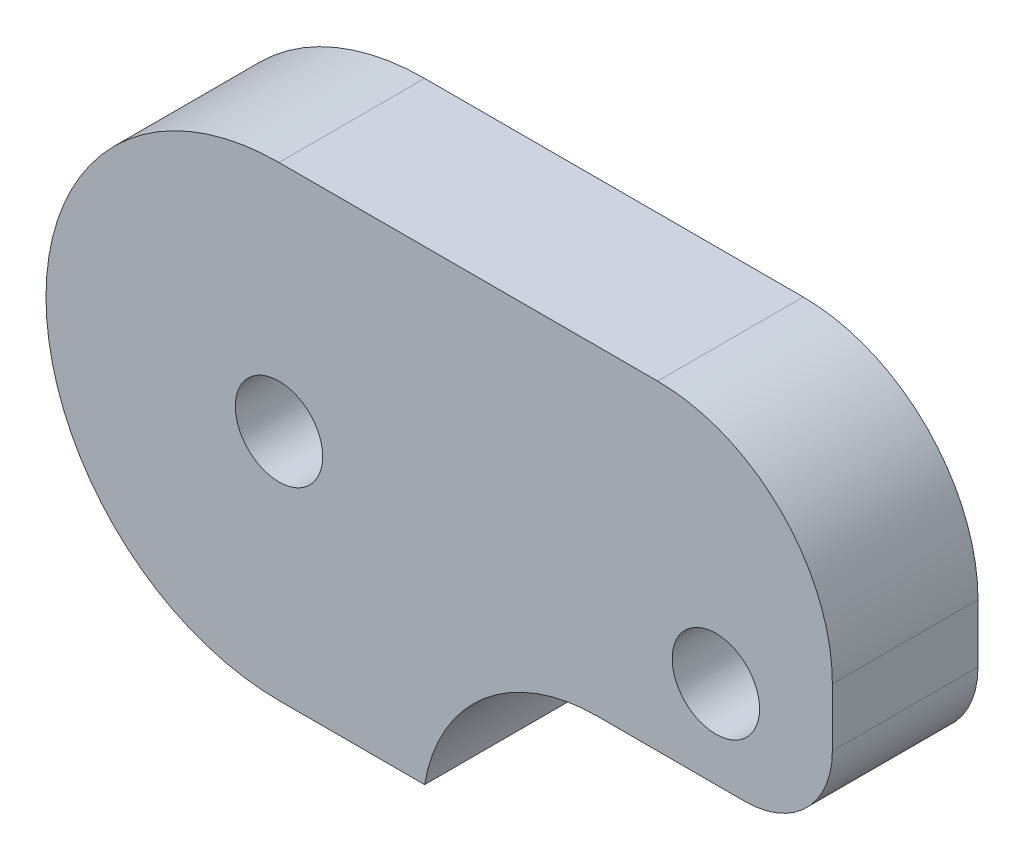
ISO-10303-21;
HEADER;
FILE_DESCRIPTION(('STEP AP214'),'2;1');
FILE_NAME('part.step','',(''),(''),'','','');
FILE_SCHEMA(('AUTOMOTIVE_DESIGN { 1 0 10303 214 1 1 1 1 }'));
ENDSEC;
DATA;
#1=APPLICATION_CONTEXT('core data for automotive mechanical design processes');
#2=APPLICATION_PROTOCOL_DEFINITION('international standard','automotive_design',2000,#1);
#3=PRODUCT_CONTEXT('',#1,'mechanical');
#4=PRODUCT('Part','Part','',(#3));
#5=PRODUCT_RELATED_PRODUCT_CATEGORY('part','',(#4));
#6=PRODUCT_DEFINITION_FORMATION('','',#4);
#7=PRODUCT_DEFINITION_CONTEXT('part definition',#1,'design');
#8=PRODUCT_DEFINITION('design','',#6,#7);
#9=PRODUCT_DEFINITION_SHAPE('','',#8);
#10=(LENGTH_UNIT() NAMED_UNIT(*) SI_UNIT(.MILLI.,.METRE.));
#11=(NAMED_UNIT(*) PLANE_ANGLE_UNIT() SI_UNIT($,.RADIAN.));
#12=(NAMED_UNIT(*) SI_UNIT($,.STERADIAN.) SOLID_ANGLE_UNIT());
#13=UNCERTAINTY_MEASURE_WITH_UNIT(LENGTH_MEASURE(1.E-05),#10,'distance_accuracy_value','');
#14=(GEOMETRIC_REPRESENTATION_CONTEXT(3) GLOBAL_UNCERTAINTY_ASSIGNED_CONTEXT((#13)) GLOBAL_UNIT_ASSIGNED_CONTEXT((#10,
#11,#12)) REPRESENTATION_CONTEXT('',''));
#15=CARTESIAN_POINT('',(0.,0.,0.));
#16=DIRECTION('',(0.,0.,1.));
#17=DIRECTION('',(1.,0.,0.));
#18=AXIS2_PLACEMENT_3D('',#15,#16,#17);
#19=CARTESIAN_POINT('',(15.,0.,5.));
#20=DIRECTION('',(0.,0.,1.));
#21=DIRECTION('',(1.,0.,0.));
#22=AXIS2_PLACEMENT_3D('',#19,#20,#21);
#23=PLANE('',#22);
#24=CARTESIAN_POINT('',(15.,0.,5.));
#25=DIRECTION('',(0.,0.,1.));
#26=DIRECTION('',(1.,0.,0.));
#27=AXIS2_PLACEMENT_3D('',#24,#25,#26);
#28=CIRCLE('',#27,1.5);
#29=CARTESIAN_POINT('',(16.5,0.,5.));
#30=VERTEX_POINT('',#29);
#31=EDGE_CURVE('E173',#30,#30,#28,.T.);
#32=ORIENTED_EDGE('',*,*,#31,.F.);
#33=EDGE_LOOP('',(#32));
#34=FACE_BOUND('',#33,.T.);
#35=DIRECTION('',(1.,0.,0.));
#36=VECTOR('',#35,1.);
#37=CARTESIAN_POINT('',(20.,-3.,5.));
#38=LINE('',#37,#36);
#39=CARTESIAN_POINT('',(25.9160797830996,-3.,5.));
#40=VERTEX_POINT('',#39);
#41=CARTESIAN_POINT('',(31.,-3.,5.));
#42=VERTEX_POINT('',#41);
#43=EDGE_CURVE('E166',#40,#42,#38,.T.);
#44=ORIENTED_EDGE('',*,*,#43,.T.);
#45=CARTESIAN_POINT('',(31.,0.,5.));
#46=DIRECTION('',(0.,0.,1.));
#47=DIRECTION('',(1.,0.,0.));
#48=AXIS2_PLACEMENT_3D('',#45,#46,#47);
#49=CIRCLE('',#48,3.);
#50=CARTESIAN_POINT('',(34.,0.,5.));
#51=VERTEX_POINT('',#50);
#52=EDGE_CURVE('E11',#42,#51,#49,.T.);
#53=ORIENTED_EDGE('',*,*,#52,.T.);
#54=DIRECTION('',(0.,1.,0.));
#55=VECTOR('',#54,1.);
#56=CARTESIAN_POINT('',(34.,-3.,5.));
#57=LINE('',#56,#55);
#58=CARTESIAN_POINT('',(34.,2.,5.));
#59=VERTEX_POINT('',#58);
#60=EDGE_CURVE('E151',#51,#59,#57,.T.);
#61=ORIENTED_EDGE('',*,*,#60,.T.);
#62=CARTESIAN_POINT('',(28.,2.,5.));
#63=DIRECTION('',(0.,0.,1.));
#64=DIRECTION('',(1.,0.,0.));
#65=AXIS2_PLACEMENT_3D('',#62,#63,#64);
#66=CIRCLE('',#65,6.);
#67=CARTESIAN_POINT('',(28.,8.,5.));
#68=VERTEX_POINT('',#67);
#69=EDGE_CURVE('E103',#59,#68,#66,.T.);
#70=ORIENTED_EDGE('',*,*,#69,.T.);
#71=DIRECTION('',(-1.,0.,0.));
#72=VECTOR('',#71,1.);
#73=CARTESIAN_POINT('',(15.,8.,5.));
#74=LINE('',#73,#72);
#75=CARTESIAN_POINT('',(15.,8.,5.));
#76=VERTEX_POINT('',#75);
#77=EDGE_CURVE('E97',#68,#76,#74,.T.);
#78=ORIENTED_EDGE('',*,*,#77,.T.);
#79=CARTESIAN_POINT('',(15.,0.,5.));
#80=DIRECTION('',(0.,0.,1.));
#81=DIRECTION('',(1.,0.,0.));
#82=AXIS2_PLACEMENT_3D('',#79,#80,#81);
#83=CIRCLE('',#82,8.);
#84=CARTESIAN_POINT('',(15.,-8.,5.));
#85=VERTEX_POINT('',#84);
#86=EDGE_CURVE('E100',#76,#85,#83,.T.);
#87=ORIENTED_EDGE('',*,*,#86,.T.);
#88=DIRECTION('',(1.,0.,0.));
#89=VECTOR('',#88,1.);
#90=CARTESIAN_POINT('',(15.,-8.,5.));
#91=LINE('',#90,#89);
#92=CARTESIAN_POINT('',(20.,-8.,5.));
#93=VERTEX_POINT('',#92);
#94=EDGE_CURVE('E117',#85,#93,#91,.T.);
#95=ORIENTED_EDGE('',*,*,#94,.T.);
#96=CARTESIAN_POINT('',(25.9160797830996,-9.,5.));
#97=DIRECTION('',(0.,0.,1.));
#98=DIRECTION('',(1.,0.,0.));
#99=AXIS2_PLACEMENT_3D('',#96,#97,#98);
#100=CIRCLE('',#99,6.);
#101=EDGE_CURVE('E142',#93,#40,#100,.F.);
#102=ORIENTED_EDGE('',*,*,#101,.T.);
#103=EDGE_LOOP('',(#44,#53,#61,#70,#78,#87,#95,#102));
#104=FACE_BOUND('',#103,.T.);
#105=CARTESIAN_POINT('',(30.,0.,5.));
#106=DIRECTION('',(0.,0.,1.));
#107=DIRECTION('',(1.,0.,0.));
#108=AXIS2_PLACEMENT_3D('',#105,#106,#107);
#109=CIRCLE('',#108,1.5);
#110=CARTESIAN_POINT('',(31.5,0.,5.));
#111=VERTEX_POINT('',#110);
#112=EDGE_CURVE('E223',#111,#111,#109,.T.);
#113=ORIENTED_EDGE('',*,*,#112,.F.);
#114=EDGE_LOOP('',(#113));
#115=FACE_BOUND('',#114,.T.);
#116=ADVANCED_FACE('F33',(#34,#104,#115),#23,.T.);
#117=CARTESIAN_POINT('',(15.,0.,0.));
#118=DIRECTION('',(0.,0.,1.));
#119=DIRECTION('',(1.,0.,0.));
#120=AXIS2_PLACEMENT_3D('',#117,#118,#119);
#121=PLANE('',#120);
#122=CARTESIAN_POINT('',(15.,0.,0.));
#123=DIRECTION('',(0.,0.,1.));
#124=DIRECTION('',(1.,0.,0.));
#125=AXIS2_PLACEMENT_3D('',#122,#123,#124);
#126=CIRCLE('',#125,1.5);
#127=CARTESIAN_POINT('',(16.5,0.,0.));
#128=VERTEX_POINT('',#127);
#129=EDGE_CURVE('E228',#128,#128,#126,.T.);
#130=ORIENTED_EDGE('',*,*,#129,.T.);
#131=EDGE_LOOP('',(#130));
#132=FACE_BOUND('',#131,.T.);
#133=DIRECTION('',(0.,1.,0.));
#134=VECTOR('',#133,1.);
#135=CARTESIAN_POINT('',(34.,-3.,0.));
#136=LINE('',#135,#134);
#137=CARTESIAN_POINT('',(34.,0.,0.));
#138=VERTEX_POINT('',#137);
#139=CARTESIAN_POINT('',(34.,2.,0.));
#140=VERTEX_POINT('',#139);
#141=EDGE_CURVE('E108',#138,#140,#136,.T.);
#142=ORIENTED_EDGE('',*,*,#141,.F.);
#143=CARTESIAN_POINT('',(31.,0.,0.));
#144=DIRECTION('',(0.,0.,1.));
#145=DIRECTION('',(1.,0.,0.));
#146=AXIS2_PLACEMENT_3D('',#143,#144,#145);
#147=CIRCLE('',#146,3.);
#148=CARTESIAN_POINT('',(31.,-3.,0.));
#149=VERTEX_POINT('',#148);
#150=EDGE_CURVE('E55',#138,#149,#147,.F.);
#151=ORIENTED_EDGE('',*,*,#150,.T.);
#152=DIRECTION('',(1.,0.,0.));
#153=VECTOR('',#152,1.);
#154=CARTESIAN_POINT('',(20.,-3.,0.));
#155=LINE('',#154,#153);
#156=CARTESIAN_POINT('',(25.9160797830996,-3.,0.));
#157=VERTEX_POINT('',#156);
#158=EDGE_CURVE('E157',#157,#149,#155,.T.);
#159=ORIENTED_EDGE('',*,*,#158,.F.);
#160=CARTESIAN_POINT('',(25.9160797830996,-9.,0.));
#161=DIRECTION('',(0.,0.,1.));
#162=DIRECTION('',(1.,0.,0.));
#163=AXIS2_PLACEMENT_3D('',#160,#161,#162);
#164=CIRCLE('',#163,6.);
#165=CARTESIAN_POINT('',(20.,-8.,0.));
#166=VERTEX_POINT('',#165);
#167=EDGE_CURVE('E140',#157,#166,#164,.T.);
#168=ORIENTED_EDGE('',*,*,#167,.T.);
#169=DIRECTION('',(1.,0.,0.));
#170=VECTOR('',#169,1.);
#171=CARTESIAN_POINT('',(15.,-8.,0.));
#172=LINE('',#171,#170);
#173=CARTESIAN_POINT('',(15.,-8.,0.));
#174=VERTEX_POINT('',#173);
#175=EDGE_CURVE('E159',#174,#166,#172,.T.);
#176=ORIENTED_EDGE('',*,*,#175,.F.);
#177=CARTESIAN_POINT('',(15.,0.,0.));
#178=DIRECTION('',(0.,0.,1.));
#179=DIRECTION('',(1.,0.,0.));
#180=AXIS2_PLACEMENT_3D('',#177,#178,#179);
#181=CIRCLE('',#180,8.);
#182=CARTESIAN_POINT('',(15.,8.,0.));
#183=VERTEX_POINT('',#182);
#184=EDGE_CURVE('E172',#183,#174,#181,.T.);
#185=ORIENTED_EDGE('',*,*,#184,.F.);
#186=DIRECTION('',(-1.,0.,0.));
#187=VECTOR('',#186,1.);
#188=CARTESIAN_POINT('',(15.,8.,0.));
#189=LINE('',#188,#187);
#190=CARTESIAN_POINT('',(28.,8.,0.));
#191=VERTEX_POINT('',#190);
#192=EDGE_CURVE('E121',#191,#183,#189,.T.);
#193=ORIENTED_EDGE('',*,*,#192,.F.);
#194=CARTESIAN_POINT('',(28.,2.,0.));
#195=DIRECTION('',(0.,0.,1.));
#196=DIRECTION('',(1.,0.,0.));
#197=AXIS2_PLACEMENT_3D('',#194,#195,#196);
#198=CIRCLE('',#197,6.);
#199=EDGE_CURVE('E125',#191,#140,#198,.F.);
#200=ORIENTED_EDGE('',*,*,#199,.T.);
#201=EDGE_LOOP('',(#142,#151,#159,#168,#176,#185,#193,#200));
#202=FACE_BOUND('',#201,.T.);
#203=CARTESIAN_POINT('',(30.,0.,0.));
#204=DIRECTION('',(0.,0.,1.));
#205=DIRECTION('',(1.,0.,0.));
#206=AXIS2_PLACEMENT_3D('',#203,#204,#205);
#207=CIRCLE('',#206,1.5);
#208=CARTESIAN_POINT('',(31.5,0.,0.));
#209=VERTEX_POINT('',#208);
#210=EDGE_CURVE('E226',#209,#209,#207,.T.);
#211=ORIENTED_EDGE('',*,*,#210,.T.);
#212=EDGE_LOOP('',(#211));
#213=FACE_BOUND('',#212,.T.);
#214=ADVANCED_FACE('F154',(#132,#202,#213),#121,.F.);
#215=CARTESIAN_POINT('',(15.,8.,5.));
#216=DIRECTION('',(0.,-1.,0.));
#217=DIRECTION('',(0.,0.,-1.));
#218=AXIS2_PLACEMENT_3D('',#215,#216,#217);
#219=PLANE('',#218);
#220=ORIENTED_EDGE('',*,*,#77,.F.);
#221=DIRECTION('',(0.,0.,-1.));
#222=VECTOR('',#221,1.);
#223=CARTESIAN_POINT('',(28.,8.,5.));
#224=LINE('',#223,#222);
#225=EDGE_CURVE('E123',#68,#191,#224,.T.);
#226=ORIENTED_EDGE('',*,*,#225,.T.);
#227=ORIENTED_EDGE('',*,*,#192,.T.);
#228=DIRECTION('',(0.,0.,-1.));
#229=VECTOR('',#228,1.);
#230=CARTESIAN_POINT('',(15.,8.,5.));
#231=LINE('',#230,#229);
#232=EDGE_CURVE('E113',#76,#183,#231,.T.);
#233=ORIENTED_EDGE('',*,*,#232,.F.);
#234=EDGE_LOOP('',(#220,#226,#227,#233));
#235=FACE_BOUND('',#234,.T.);
#236=ADVANCED_FACE('F119',(#235),#219,.F.);
#237=CARTESIAN_POINT('',(15.,0.,5.));
#238=DIRECTION('',(0.,0.,-1.));
#239=DIRECTION('',(-1.,0.,0.));
#240=AXIS2_PLACEMENT_3D('',#237,#238,#239);
#241=CYLINDRICAL_SURFACE('',#240,8.);
#242=ORIENTED_EDGE('',*,*,#184,.T.);
#243=DIRECTION('',(0.,0.,-1.));
#244=VECTOR('',#243,1.);
#245=CARTESIAN_POINT('',(15.,-8.,5.));
#246=LINE('',#245,#244);
#247=EDGE_CURVE('E115',#85,#174,#246,.T.);
#248=ORIENTED_EDGE('',*,*,#247,.F.);
#249=ORIENTED_EDGE('',*,*,#86,.F.);
#250=ORIENTED_EDGE('',*,*,#232,.T.);
#251=EDGE_LOOP('',(#242,#248,#249,#250));
#252=FACE_BOUND('',#251,.T.);
#253=ADVANCED_FACE('F112',(#252),#241,.T.);
#254=CARTESIAN_POINT('',(15.,-8.,5.));
#255=DIRECTION('',(0.,1.,0.));
#256=DIRECTION('',(0.,0.,1.));
#257=AXIS2_PLACEMENT_3D('',#254,#255,#256);
#258=PLANE('',#257);
#259=ORIENTED_EDGE('',*,*,#175,.T.);
#260=DIRECTION('',(0.,0.,-1.));
#261=VECTOR('',#260,1.);
#262=CARTESIAN_POINT('',(20.,-8.,5.));
#263=LINE('',#262,#261);
#264=EDGE_CURVE('E127',#93,#166,#263,.T.);
#265=ORIENTED_EDGE('',*,*,#264,.F.);
#266=ORIENTED_EDGE('',*,*,#94,.F.);
#267=ORIENTED_EDGE('',*,*,#247,.T.);
#268=EDGE_LOOP('',(#259,#265,#266,#267));
#269=FACE_BOUND('',#268,.T.);
#270=ADVANCED_FACE('F177',(#269),#258,.F.);
#271=CARTESIAN_POINT('',(20.,-3.,5.));
#272=DIRECTION('',(0.,1.,0.));
#273=DIRECTION('',(0.,0.,1.));
#274=AXIS2_PLACEMENT_3D('',#271,#272,#273);
#275=PLANE('',#274);
#276=ORIENTED_EDGE('',*,*,#158,.T.);
#277=DIRECTION('',(0.,0.,-1.));
#278=VECTOR('',#277,1.);
#279=CARTESIAN_POINT('',(31.,-3.,5.));
#280=LINE('',#279,#278);
#281=EDGE_CURVE('E41',#149,#42,#280,.F.);
#282=ORIENTED_EDGE('',*,*,#281,.T.);
#283=ORIENTED_EDGE('',*,*,#43,.F.);
#284=DIRECTION('',(0.,0.,-1.));
#285=VECTOR('',#284,1.);
#286=CARTESIAN_POINT('',(25.9160797830996,-3.,5.));
#287=LINE('',#286,#285);
#288=EDGE_CURVE('E137',#40,#157,#287,.T.);
#289=ORIENTED_EDGE('',*,*,#288,.T.);
#290=EDGE_LOOP('',(#276,#282,#283,#289));
#291=FACE_BOUND('',#290,.T.);
#292=ADVANCED_FACE('F180',(#291),#275,.F.);
#293=CARTESIAN_POINT('',(34.,-3.,5.));
#294=DIRECTION('',(-1.,0.,0.));
#295=DIRECTION('',(0.,0.,1.));
#296=AXIS2_PLACEMENT_3D('',#293,#294,#295);
#297=PLANE('',#296);
#298=ORIENTED_EDGE('',*,*,#60,.F.);
#299=DIRECTION('',(0.,0.,-1.));
#300=VECTOR('',#299,1.);
#301=CARTESIAN_POINT('',(34.,0.,5.));
#302=LINE('',#301,#300);
#303=EDGE_CURVE('E144',#51,#138,#302,.T.);
#304=ORIENTED_EDGE('',*,*,#303,.T.);
#305=ORIENTED_EDGE('',*,*,#141,.T.);
#306=DIRECTION('',(0.,0.,-1.));
#307=VECTOR('',#306,1.);
#308=CARTESIAN_POINT('',(34.,2.,5.));
#309=LINE('',#308,#307);
#310=EDGE_CURVE('E133',#140,#59,#309,.F.);
#311=ORIENTED_EDGE('',*,*,#310,.T.);
#312=EDGE_LOOP('',(#298,#304,#305,#311));
#313=FACE_BOUND('',#312,.T.);
#314=ADVANCED_FACE('F150',(#313),#297,.F.);
#315=CARTESIAN_POINT('',(15.,0.,5.));
#316=DIRECTION('',(0.,0.,-1.));
#317=DIRECTION('',(-1.,0.,0.));
#318=AXIS2_PLACEMENT_3D('',#315,#316,#317);
#319=CYLINDRICAL_SURFACE('',#318,1.5);
#320=ORIENTED_EDGE('',*,*,#31,.T.);
#321=EDGE_LOOP('',(#320));
#322=FACE_BOUND('',#321,.T.);
#323=ORIENTED_EDGE('',*,*,#129,.F.);
#324=EDGE_LOOP('',(#323));
#325=FACE_BOUND('',#324,.T.);
#326=ADVANCED_FACE('F196',(#322,#325),#319,.F.);
#327=CARTESIAN_POINT('',(30.,0.,5.));
#328=DIRECTION('',(0.,0.,-1.));
#329=DIRECTION('',(-1.,0.,0.));
#330=AXIS2_PLACEMENT_3D('',#327,#328,#329);
#331=CYLINDRICAL_SURFACE('',#330,1.5);
#332=ORIENTED_EDGE('',*,*,#112,.T.);
#333=EDGE_LOOP('',(#332));
#334=FACE_BOUND('',#333,.T.);
#335=ORIENTED_EDGE('',*,*,#210,.F.);
#336=EDGE_LOOP('',(#335));
#337=FACE_BOUND('',#336,.T.);
#338=ADVANCED_FACE('F210',(#334,#337),#331,.F.);
#339=CARTESIAN_POINT('',(28.,2.,5.));
#340=DIRECTION('',(0.,0.,-1.));
#341=DIRECTION('',(-1.,0.,0.));
#342=AXIS2_PLACEMENT_3D('',#339,#340,#341);
#343=CYLINDRICAL_SURFACE('',#342,6.);
#344=ORIENTED_EDGE('',*,*,#69,.F.);
#345=ORIENTED_EDGE('',*,*,#310,.F.);
#346=ORIENTED_EDGE('',*,*,#199,.F.);
#347=ORIENTED_EDGE('',*,*,#225,.F.);
#348=EDGE_LOOP('',(#344,#345,#346,#347));
#349=FACE_BOUND('',#348,.T.);
#350=ADVANCED_FACE('F185',(#349),#343,.T.);
#351=CARTESIAN_POINT('',(25.9160797830996,-9.,5.));
#352=DIRECTION('',(0.,0.,-1.));
#353=DIRECTION('',(-1.,0.,0.));
#354=AXIS2_PLACEMENT_3D('',#351,#352,#353);
#355=CYLINDRICAL_SURFACE('',#354,6.);
#356=ORIENTED_EDGE('',*,*,#101,.F.);
#357=ORIENTED_EDGE('',*,*,#264,.T.);
#358=ORIENTED_EDGE('',*,*,#167,.F.);
#359=ORIENTED_EDGE('',*,*,#288,.F.);
#360=EDGE_LOOP('',(#356,#357,#358,#359));
#361=FACE_BOUND('',#360,.T.);
#362=ADVANCED_FACE('F179',(#361),#355,.F.);
#363=CARTESIAN_POINT('',(31.,0.,5.));
#364=DIRECTION('',(0.,0.,-1.));
#365=DIRECTION('',(-1.,0.,0.));
#366=AXIS2_PLACEMENT_3D('',#363,#364,#365);
#367=CYLINDRICAL_SURFACE('',#366,3.);
#368=ORIENTED_EDGE('',*,*,#52,.F.);
#369=ORIENTED_EDGE('',*,*,#281,.F.);
#370=ORIENTED_EDGE('',*,*,#150,.F.);
#371=ORIENTED_EDGE('',*,*,#303,.F.);
#372=EDGE_LOOP('',(#368,#369,#370,#371));
#373=FACE_BOUND('',#372,.T.);
#374=ADVANCED_FACE('F35',(#373),#367,.T.);
#375=CLOSED_SHELL('',(#116,#214,#236,#253,#270,#292,#314,#326,#338,#350,#362,#374));
#376=MANIFOLD_SOLID_BREP('B2',#375);
#377=ADVANCED_BREP_SHAPE_REPRESENTATION('',(#18,#376),#14);
#378=SHAPE_DEFINITION_REPRESENTATION(#9,#377);
ENDSEC;
END-ISO-10303-21;
